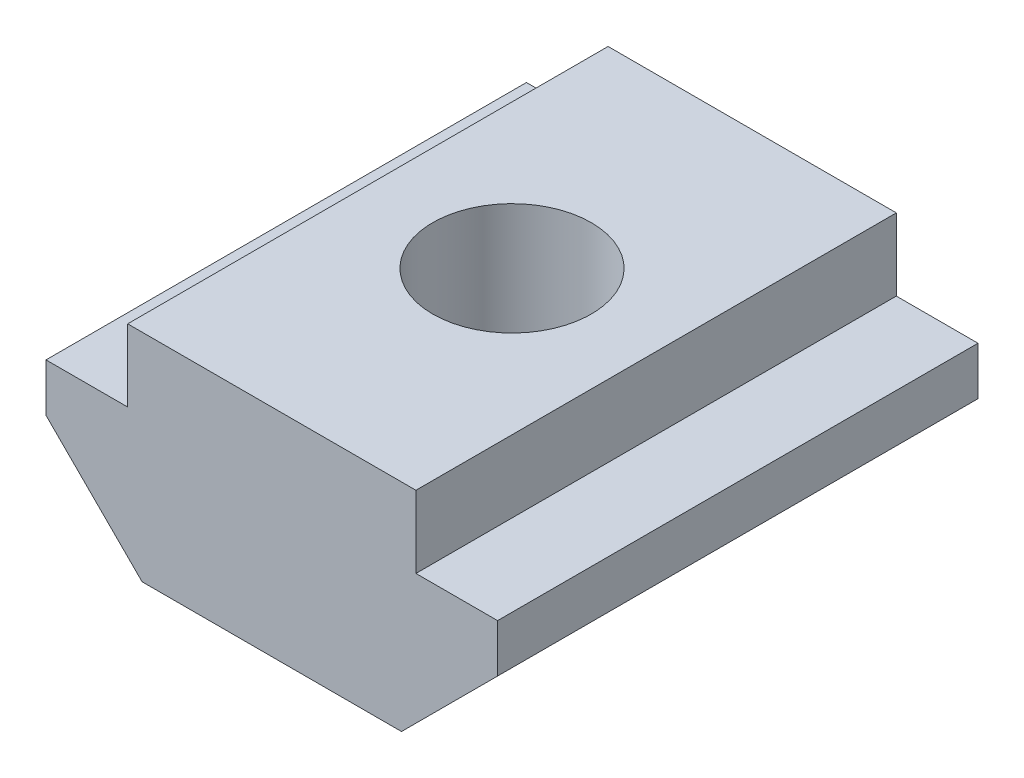
ISO-10303-21;
HEADER;
FILE_DESCRIPTION(('STEP AP214'),'2;1');
FILE_NAME('part.step','',(''),(''),'','','');
FILE_SCHEMA(('AUTOMOTIVE_DESIGN { 1 0 10303 214 1 1 1 1 }'));
ENDSEC;
DATA;
#1=APPLICATION_CONTEXT('core data for automotive mechanical design processes');
#2=APPLICATION_PROTOCOL_DEFINITION('international standard','automotive_design',2000,#1);
#3=PRODUCT_CONTEXT('',#1,'mechanical');
#4=PRODUCT('Part','Part','',(#3));
#5=PRODUCT_RELATED_PRODUCT_CATEGORY('part','',(#4));
#6=PRODUCT_DEFINITION_FORMATION('','',#4);
#7=PRODUCT_DEFINITION_CONTEXT('part definition',#1,'design');
#8=PRODUCT_DEFINITION('design','',#6,#7);
#9=PRODUCT_DEFINITION_SHAPE('','',#8);
#10=(LENGTH_UNIT() NAMED_UNIT(*) SI_UNIT(.MILLI.,.METRE.));
#11=(NAMED_UNIT(*) PLANE_ANGLE_UNIT() SI_UNIT($,.RADIAN.));
#12=(NAMED_UNIT(*) SI_UNIT($,.STERADIAN.) SOLID_ANGLE_UNIT());
#13=UNCERTAINTY_MEASURE_WITH_UNIT(LENGTH_MEASURE(1.E-05),#10,'distance_accuracy_value','');
#14=(GEOMETRIC_REPRESENTATION_CONTEXT(3) GLOBAL_UNCERTAINTY_ASSIGNED_CONTEXT((#13)) GLOBAL_UNIT_ASSIGNED_CONTEXT((#10,
#11,#12)) REPRESENTATION_CONTEXT('',''));
#15=CARTESIAN_POINT('',(0.,0.,0.));
#16=DIRECTION('',(0.,0.,1.));
#17=DIRECTION('',(1.,0.,0.));
#18=AXIS2_PLACEMENT_3D('',#15,#16,#17);
#19=CARTESIAN_POINT('',(0.,-1.,10.));
#20=DIRECTION('',(1.,0.,0.));
#21=DIRECTION('',(0.,0.,-1.));
#22=AXIS2_PLACEMENT_3D('',#19,#20,#21);
#23=PLANE('',#22);
#24=DIRECTION('',(0.,-1.,0.));
#25=VECTOR('',#24,1.);
#26=CARTESIAN_POINT('',(0.,-1.,0.));
#27=LINE('',#26,#25);
#28=CARTESIAN_POINT('',(0.,0.,0.));
#29=VERTEX_POINT('',#28);
#30=CARTESIAN_POINT('',(0.,-1.,0.));
#31=VERTEX_POINT('',#30);
#32=EDGE_CURVE('E162',#29,#31,#27,.T.);
#33=ORIENTED_EDGE('',*,*,#32,.T.);
#34=DIRECTION('',(0.,0.,-1.));
#35=VECTOR('',#34,1.);
#36=CARTESIAN_POINT('',(0.,-1.,10.));
#37=LINE('',#36,#35);
#38=CARTESIAN_POINT('',(0.,-1.,10.));
#39=VERTEX_POINT('',#38);
#40=EDGE_CURVE('E11',#39,#31,#37,.T.);
#41=ORIENTED_EDGE('',*,*,#40,.F.);
#42=DIRECTION('',(0.,-1.,0.));
#43=VECTOR('',#42,1.);
#44=CARTESIAN_POINT('',(0.,-1.,10.));
#45=LINE('',#44,#43);
#46=CARTESIAN_POINT('',(0.,0.,10.));
#47=VERTEX_POINT('',#46);
#48=EDGE_CURVE('E191',#47,#39,#45,.T.);
#49=ORIENTED_EDGE('',*,*,#48,.F.);
#50=DIRECTION('',(0.,0.,-1.));
#51=VECTOR('',#50,1.);
#52=CARTESIAN_POINT('',(0.,0.,10.));
#53=LINE('',#52,#51);
#54=EDGE_CURVE('E158',#47,#29,#53,.T.);
#55=ORIENTED_EDGE('',*,*,#54,.T.);
#56=EDGE_LOOP('',(#33,#41,#49,#55));
#57=FACE_BOUND('',#56,.T.);
#58=ADVANCED_FACE('F49',(#57),#23,.F.);
#59=CARTESIAN_POINT('',(2.,-3.,10.));
#60=DIRECTION('',(0.707106781186547,0.707106781186548,0.));
#61=DIRECTION('',(-0.707106781186548,0.707106781186547,0.));
#62=AXIS2_PLACEMENT_3D('',#59,#60,#61);
#63=PLANE('',#62);
#64=DIRECTION('',(0.707106781186548,-0.707106781186547,0.));
#65=VECTOR('',#64,1.);
#66=CARTESIAN_POINT('',(2.,-3.,0.));
#67=LINE('',#66,#65);
#68=CARTESIAN_POINT('',(2.,-3.,0.));
#69=VERTEX_POINT('',#68);
#70=EDGE_CURVE('E166',#31,#69,#67,.T.);
#71=ORIENTED_EDGE('',*,*,#70,.T.);
#72=DIRECTION('',(0.,0.,-1.));
#73=VECTOR('',#72,1.);
#74=CARTESIAN_POINT('',(2.,-3.,10.));
#75=LINE('',#74,#73);
#76=CARTESIAN_POINT('',(2.,-3.,10.));
#77=VERTEX_POINT('',#76);
#78=EDGE_CURVE('E58',#77,#69,#75,.T.);
#79=ORIENTED_EDGE('',*,*,#78,.F.);
#80=DIRECTION('',(0.707106781186548,-0.707106781186547,0.));
#81=VECTOR('',#80,1.);
#82=CARTESIAN_POINT('',(2.,-3.,10.));
#83=LINE('',#82,#81);
#84=EDGE_CURVE('E115',#39,#77,#83,.T.);
#85=ORIENTED_EDGE('',*,*,#84,.F.);
#86=ORIENTED_EDGE('',*,*,#40,.T.);
#87=EDGE_LOOP('',(#71,#79,#85,#86));
#88=FACE_BOUND('',#87,.T.);
#89=ADVANCED_FACE('F278',(#88),#63,.F.);
#90=CARTESIAN_POINT('',(7.4,-3.,10.));
#91=DIRECTION('',(0.,1.,0.));
#92=DIRECTION('',(-1.,0.,0.));
#93=AXIS2_PLACEMENT_3D('',#90,#91,#92);
#94=PLANE('',#93);
#95=CARTESIAN_POINT('',(4.7,-3.,5.));
#96=DIRECTION('',(0.,1.,0.));
#97=DIRECTION('',(0.,0.,1.));
#98=AXIS2_PLACEMENT_3D('',#95,#96,#97);
#99=CIRCLE('',#98,1.65);
#100=CARTESIAN_POINT('',(4.7,-3.,6.65));
#101=VERTEX_POINT('',#100);
#102=EDGE_CURVE('E167',#101,#101,#99,.T.);
#103=ORIENTED_EDGE('',*,*,#102,.T.);
#104=EDGE_LOOP('',(#103));
#105=FACE_BOUND('',#104,.T.);
#106=DIRECTION('',(1.,0.,0.));
#107=VECTOR('',#106,1.);
#108=CARTESIAN_POINT('',(7.4,-3.,0.));
#109=LINE('',#108,#107);
#110=CARTESIAN_POINT('',(7.4,-3.,0.));
#111=VERTEX_POINT('',#110);
#112=EDGE_CURVE('E170',#69,#111,#109,.T.);
#113=ORIENTED_EDGE('',*,*,#112,.T.);
#114=DIRECTION('',(0.,0.,-1.));
#115=VECTOR('',#114,1.);
#116=CARTESIAN_POINT('',(7.4,-3.,10.));
#117=LINE('',#116,#115);
#118=CARTESIAN_POINT('',(7.4,-3.,10.));
#119=VERTEX_POINT('',#118);
#120=EDGE_CURVE('E210',#119,#111,#117,.T.);
#121=ORIENTED_EDGE('',*,*,#120,.F.);
#122=DIRECTION('',(1.,0.,0.));
#123=VECTOR('',#122,1.);
#124=CARTESIAN_POINT('',(7.4,-3.,10.));
#125=LINE('',#124,#123);
#126=EDGE_CURVE('E220',#77,#119,#125,.T.);
#127=ORIENTED_EDGE('',*,*,#126,.F.);
#128=ORIENTED_EDGE('',*,*,#78,.T.);
#129=EDGE_LOOP('',(#113,#121,#127,#128));
#130=FACE_BOUND('',#129,.T.);
#131=ADVANCED_FACE('F218',(#105,#130),#94,.F.);
#132=CARTESIAN_POINT('',(9.4,-1.,10.));
#133=DIRECTION('',(-0.707106781186548,0.707106781186548,0.));
#134=DIRECTION('',(-0.707106781186548,-0.707106781186548,0.));
#135=AXIS2_PLACEMENT_3D('',#132,#133,#134);
#136=PLANE('',#135);
#137=DIRECTION('',(0.707106781186548,0.707106781186548,0.));
#138=VECTOR('',#137,1.);
#139=CARTESIAN_POINT('',(9.4,-1.,0.));
#140=LINE('',#139,#138);
#141=CARTESIAN_POINT('',(9.4,-1.,0.));
#142=VERTEX_POINT('',#141);
#143=EDGE_CURVE('E173',#111,#142,#140,.T.);
#144=ORIENTED_EDGE('',*,*,#143,.T.);
#145=DIRECTION('',(0.,0.,-1.));
#146=VECTOR('',#145,1.);
#147=CARTESIAN_POINT('',(9.4,-1.,10.));
#148=LINE('',#147,#146);
#149=CARTESIAN_POINT('',(9.4,-1.,10.));
#150=VERTEX_POINT('',#149);
#151=EDGE_CURVE('E206',#150,#142,#148,.T.);
#152=ORIENTED_EDGE('',*,*,#151,.F.);
#153=DIRECTION('',(0.707106781186548,0.707106781186548,0.));
#154=VECTOR('',#153,1.);
#155=CARTESIAN_POINT('',(9.4,-1.,10.));
#156=LINE('',#155,#154);
#157=EDGE_CURVE('E239',#119,#150,#156,.T.);
#158=ORIENTED_EDGE('',*,*,#157,.F.);
#159=ORIENTED_EDGE('',*,*,#120,.T.);
#160=EDGE_LOOP('',(#144,#152,#158,#159));
#161=FACE_BOUND('',#160,.T.);
#162=ADVANCED_FACE('F229',(#161),#136,.F.);
#163=CARTESIAN_POINT('',(9.4,0.,10.));
#164=DIRECTION('',(-1.,0.,0.));
#165=DIRECTION('',(0.,0.,1.));
#166=AXIS2_PLACEMENT_3D('',#163,#164,#165);
#167=PLANE('',#166);
#168=DIRECTION('',(0.,1.,0.));
#169=VECTOR('',#168,1.);
#170=CARTESIAN_POINT('',(9.4,0.,0.));
#171=LINE('',#170,#169);
#172=CARTESIAN_POINT('',(9.4,0.,0.));
#173=VERTEX_POINT('',#172);
#174=EDGE_CURVE('E176',#142,#173,#171,.T.);
#175=ORIENTED_EDGE('',*,*,#174,.T.);
#176=DIRECTION('',(0.,0.,-1.));
#177=VECTOR('',#176,1.);
#178=CARTESIAN_POINT('',(9.4,0.,10.));
#179=LINE('',#178,#177);
#180=CARTESIAN_POINT('',(9.4,0.,10.));
#181=VERTEX_POINT('',#180);
#182=EDGE_CURVE('E202',#181,#173,#179,.T.);
#183=ORIENTED_EDGE('',*,*,#182,.F.);
#184=DIRECTION('',(0.,1.,0.));
#185=VECTOR('',#184,1.);
#186=CARTESIAN_POINT('',(9.4,0.,10.));
#187=LINE('',#186,#185);
#188=EDGE_CURVE('E235',#150,#181,#187,.T.);
#189=ORIENTED_EDGE('',*,*,#188,.F.);
#190=ORIENTED_EDGE('',*,*,#151,.T.);
#191=EDGE_LOOP('',(#175,#183,#189,#190));
#192=FACE_BOUND('',#191,.T.);
#193=ADVANCED_FACE('F233',(#192),#167,.F.);
#194=CARTESIAN_POINT('',(7.7,0.,10.));
#195=DIRECTION('',(0.,-1.,0.));
#196=DIRECTION('',(0.,0.,-1.));
#197=AXIS2_PLACEMENT_3D('',#194,#195,#196);
#198=PLANE('',#197);
#199=DIRECTION('',(-1.,0.,0.));
#200=VECTOR('',#199,1.);
#201=CARTESIAN_POINT('',(7.7,0.,0.));
#202=LINE('',#201,#200);
#203=CARTESIAN_POINT('',(7.7,0.,0.));
#204=VERTEX_POINT('',#203);
#205=EDGE_CURVE('E179',#173,#204,#202,.T.);
#206=ORIENTED_EDGE('',*,*,#205,.T.);
#207=DIRECTION('',(0.,0.,-1.));
#208=VECTOR('',#207,1.);
#209=CARTESIAN_POINT('',(7.7,0.,10.));
#210=LINE('',#209,#208);
#211=CARTESIAN_POINT('',(7.7,0.,10.));
#212=VERTEX_POINT('',#211);
#213=EDGE_CURVE('E198',#212,#204,#210,.T.);
#214=ORIENTED_EDGE('',*,*,#213,.F.);
#215=DIRECTION('',(-1.,0.,0.));
#216=VECTOR('',#215,1.);
#217=CARTESIAN_POINT('',(7.7,0.,10.));
#218=LINE('',#217,#216);
#219=EDGE_CURVE('E238',#181,#212,#218,.T.);
#220=ORIENTED_EDGE('',*,*,#219,.F.);
#221=ORIENTED_EDGE('',*,*,#182,.T.);
#222=EDGE_LOOP('',(#206,#214,#220,#221));
#223=FACE_BOUND('',#222,.T.);
#224=ADVANCED_FACE('F274',(#223),#198,.F.);
#225=CARTESIAN_POINT('',(7.7,1.5,10.));
#226=DIRECTION('',(-1.,0.,0.));
#227=DIRECTION('',(0.,0.,1.));
#228=AXIS2_PLACEMENT_3D('',#225,#226,#227);
#229=PLANE('',#228);
#230=DIRECTION('',(0.,1.,0.));
#231=VECTOR('',#230,1.);
#232=CARTESIAN_POINT('',(7.7,1.5,0.));
#233=LINE('',#232,#231);
#234=CARTESIAN_POINT('',(7.7,1.5,0.));
#235=VERTEX_POINT('',#234);
#236=EDGE_CURVE('E182',#204,#235,#233,.T.);
#237=ORIENTED_EDGE('',*,*,#236,.T.);
#238=DIRECTION('',(0.,0.,-1.));
#239=VECTOR('',#238,1.);
#240=CARTESIAN_POINT('',(7.7,1.5,10.));
#241=LINE('',#240,#239);
#242=CARTESIAN_POINT('',(7.7,1.5,10.));
#243=VERTEX_POINT('',#242);
#244=EDGE_CURVE('E151',#243,#235,#241,.T.);
#245=ORIENTED_EDGE('',*,*,#244,.F.);
#246=DIRECTION('',(0.,1.,0.));
#247=VECTOR('',#246,1.);
#248=CARTESIAN_POINT('',(7.7,1.5,10.));
#249=LINE('',#248,#247);
#250=EDGE_CURVE('E140',#212,#243,#249,.T.);
#251=ORIENTED_EDGE('',*,*,#250,.F.);
#252=ORIENTED_EDGE('',*,*,#213,.T.);
#253=EDGE_LOOP('',(#237,#245,#251,#252));
#254=FACE_BOUND('',#253,.T.);
#255=ADVANCED_FACE('F264',(#254),#229,.F.);
#256=CARTESIAN_POINT('',(1.7,1.5,10.));
#257=DIRECTION('',(0.,-1.,0.));
#258=DIRECTION('',(0.,0.,-1.));
#259=AXIS2_PLACEMENT_3D('',#256,#257,#258);
#260=PLANE('',#259);
#261=CARTESIAN_POINT('',(4.7,1.5,5.));
#262=DIRECTION('',(0.,1.,0.));
#263=DIRECTION('',(0.,0.,1.));
#264=AXIS2_PLACEMENT_3D('',#261,#262,#263);
#265=CIRCLE('',#264,1.64999999999999);
#266=CARTESIAN_POINT('',(4.7,1.5,6.64999999999999));
#267=VERTEX_POINT('',#266);
#268=EDGE_CURVE('E256',#267,#267,#265,.T.);
#269=ORIENTED_EDGE('',*,*,#268,.F.);
#270=EDGE_LOOP('',(#269));
#271=FACE_BOUND('',#270,.T.);
#272=DIRECTION('',(-1.,0.,0.));
#273=VECTOR('',#272,1.);
#274=CARTESIAN_POINT('',(1.7,1.5,0.));
#275=LINE('',#274,#273);
#276=CARTESIAN_POINT('',(1.7,1.5,0.));
#277=VERTEX_POINT('',#276);
#278=EDGE_CURVE('E149',#235,#277,#275,.T.);
#279=ORIENTED_EDGE('',*,*,#278,.T.);
#280=DIRECTION('',(0.,0.,-1.));
#281=VECTOR('',#280,1.);
#282=CARTESIAN_POINT('',(1.7,1.5,10.));
#283=LINE('',#282,#281);
#284=CARTESIAN_POINT('',(1.7,1.5,10.));
#285=VERTEX_POINT('',#284);
#286=EDGE_CURVE('E146',#285,#277,#283,.T.);
#287=ORIENTED_EDGE('',*,*,#286,.F.);
#288=DIRECTION('',(-1.,0.,0.));
#289=VECTOR('',#288,1.);
#290=CARTESIAN_POINT('',(1.7,1.5,10.));
#291=LINE('',#290,#289);
#292=EDGE_CURVE('E134',#243,#285,#291,.T.);
#293=ORIENTED_EDGE('',*,*,#292,.F.);
#294=ORIENTED_EDGE('',*,*,#244,.T.);
#295=EDGE_LOOP('',(#279,#287,#293,#294));
#296=FACE_BOUND('',#295,.T.);
#297=ADVANCED_FACE('F147',(#271,#296),#260,.F.);
#298=CARTESIAN_POINT('',(1.7,0.,10.));
#299=DIRECTION('',(1.,0.,0.));
#300=DIRECTION('',(0.,1.,0.));
#301=AXIS2_PLACEMENT_3D('',#298,#299,#300);
#302=PLANE('',#301);
#303=DIRECTION('',(0.,-1.,0.));
#304=VECTOR('',#303,1.);
#305=CARTESIAN_POINT('',(1.7,0.,0.));
#306=LINE('',#305,#304);
#307=CARTESIAN_POINT('',(1.7,0.,0.));
#308=VERTEX_POINT('',#307);
#309=EDGE_CURVE('E101',#277,#308,#306,.T.);
#310=ORIENTED_EDGE('',*,*,#309,.T.);
#311=DIRECTION('',(0.,0.,-1.));
#312=VECTOR('',#311,1.);
#313=CARTESIAN_POINT('',(1.7,0.,10.));
#314=LINE('',#313,#312);
#315=CARTESIAN_POINT('',(1.7,0.,10.));
#316=VERTEX_POINT('',#315);
#317=EDGE_CURVE('E152',#316,#308,#314,.T.);
#318=ORIENTED_EDGE('',*,*,#317,.F.);
#319=DIRECTION('',(0.,-1.,0.));
#320=VECTOR('',#319,1.);
#321=CARTESIAN_POINT('',(1.7,0.,10.));
#322=LINE('',#321,#320);
#323=EDGE_CURVE('E138',#285,#316,#322,.T.);
#324=ORIENTED_EDGE('',*,*,#323,.F.);
#325=ORIENTED_EDGE('',*,*,#286,.T.);
#326=EDGE_LOOP('',(#310,#318,#324,#325));
#327=FACE_BOUND('',#326,.T.);
#328=ADVANCED_FACE('F154',(#327),#302,.F.);
#329=CARTESIAN_POINT('',(0.,0.,10.));
#330=DIRECTION('',(0.,-1.,0.));
#331=DIRECTION('',(0.,0.,-1.));
#332=AXIS2_PLACEMENT_3D('',#329,#330,#331);
#333=PLANE('',#332);
#334=DIRECTION('',(-1.,0.,0.));
#335=VECTOR('',#334,1.);
#336=CARTESIAN_POINT('',(0.,0.,0.));
#337=LINE('',#336,#335);
#338=EDGE_CURVE('E107',#308,#29,#337,.T.);
#339=ORIENTED_EDGE('',*,*,#338,.T.);
#340=ORIENTED_EDGE('',*,*,#54,.F.);
#341=DIRECTION('',(-1.,0.,0.));
#342=VECTOR('',#341,1.);
#343=CARTESIAN_POINT('',(0.,0.,10.));
#344=LINE('',#343,#342);
#345=EDGE_CURVE('E66',#316,#47,#344,.T.);
#346=ORIENTED_EDGE('',*,*,#345,.F.);
#347=ORIENTED_EDGE('',*,*,#317,.T.);
#348=EDGE_LOOP('',(#339,#340,#346,#347));
#349=FACE_BOUND('',#348,.T.);
#350=ADVANCED_FACE('F271',(#349),#333,.F.);
#351=CARTESIAN_POINT('',(0.,0.,10.));
#352=DIRECTION('',(0.,0.,-1.));
#353=DIRECTION('',(-1.,0.,0.));
#354=AXIS2_PLACEMENT_3D('',#351,#352,#353);
#355=PLANE('',#354);
#356=ORIENTED_EDGE('',*,*,#48,.T.);
#357=ORIENTED_EDGE('',*,*,#84,.T.);
#358=ORIENTED_EDGE('',*,*,#126,.T.);
#359=ORIENTED_EDGE('',*,*,#157,.T.);
#360=ORIENTED_EDGE('',*,*,#188,.T.);
#361=ORIENTED_EDGE('',*,*,#219,.T.);
#362=ORIENTED_EDGE('',*,*,#250,.T.);
#363=ORIENTED_EDGE('',*,*,#292,.T.);
#364=ORIENTED_EDGE('',*,*,#323,.T.);
#365=ORIENTED_EDGE('',*,*,#345,.T.);
#366=EDGE_LOOP('',(#356,#357,#358,#359,#360,#361,#362,#363,#364,#365));
#367=FACE_BOUND('',#366,.T.);
#368=ADVANCED_FACE('F136',(#367),#355,.F.);
#369=CARTESIAN_POINT('',(0.,0.,0.));
#370=DIRECTION('',(0.,0.,-1.));
#371=DIRECTION('',(-1.,0.,0.));
#372=AXIS2_PLACEMENT_3D('',#369,#370,#371);
#373=PLANE('',#372);
#374=ORIENTED_EDGE('',*,*,#32,.F.);
#375=ORIENTED_EDGE('',*,*,#338,.F.);
#376=ORIENTED_EDGE('',*,*,#309,.F.);
#377=ORIENTED_EDGE('',*,*,#278,.F.);
#378=ORIENTED_EDGE('',*,*,#236,.F.);
#379=ORIENTED_EDGE('',*,*,#205,.F.);
#380=ORIENTED_EDGE('',*,*,#174,.F.);
#381=ORIENTED_EDGE('',*,*,#143,.F.);
#382=ORIENTED_EDGE('',*,*,#112,.F.);
#383=ORIENTED_EDGE('',*,*,#70,.F.);
#384=EDGE_LOOP('',(#374,#375,#376,#377,#378,#379,#380,#381,#382,#383));
#385=FACE_BOUND('',#384,.T.);
#386=ADVANCED_FACE('F224',(#385),#373,.T.);
#387=CARTESIAN_POINT('',(4.7,1.5,5.));
#388=DIRECTION('',(0.,1.,0.));
#389=DIRECTION('',(0.,0.,1.));
#390=AXIS2_PLACEMENT_3D('',#387,#388,#389);
#391=CYLINDRICAL_SURFACE('',#390,1.64999999999999);
#392=ORIENTED_EDGE('',*,*,#102,.F.);
#393=EDGE_LOOP('',(#392));
#394=FACE_BOUND('',#393,.T.);
#395=ORIENTED_EDGE('',*,*,#268,.T.);
#396=EDGE_LOOP('',(#395));
#397=FACE_BOUND('',#396,.T.);
#398=ADVANCED_FACE('F261',(#394,#397),#391,.F.);
#399=CLOSED_SHELL('',(#58,#89,#131,#162,#193,#224,#255,#297,#328,#350,#368,#386,#398));
#400=MANIFOLD_SOLID_BREP('B2',#399);
#401=ADVANCED_BREP_SHAPE_REPRESENTATION('',(#18,#400),#14);
#402=SHAPE_DEFINITION_REPRESENTATION(#9,#401);
ENDSEC;
END-ISO-10303-21;
